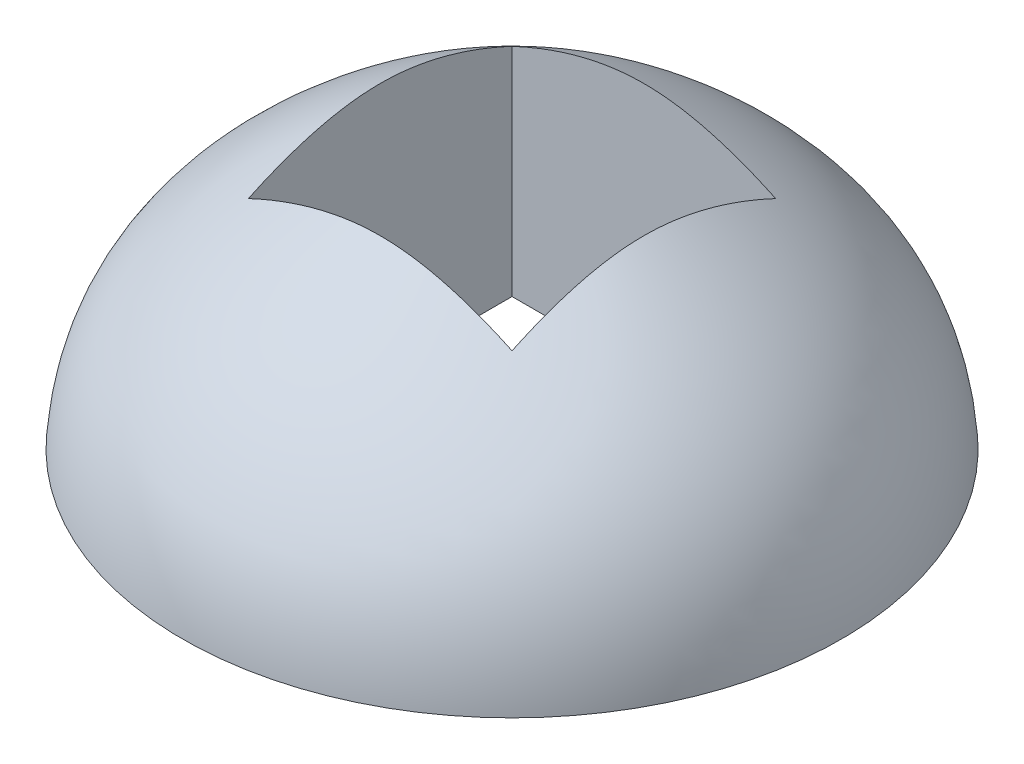
ISO-10303-21;
HEADER;
FILE_DESCRIPTION(('STEP AP214'),'2;1');
FILE_NAME('part.step','',(''),(''),'','','');
FILE_SCHEMA(('AUTOMOTIVE_DESIGN { 1 0 10303 214 1 1 1 1 }'));
ENDSEC;
DATA;
#1=APPLICATION_CONTEXT('core data for automotive mechanical design processes');
#2=APPLICATION_PROTOCOL_DEFINITION('international standard','automotive_design',2000,#1);
#3=PRODUCT_CONTEXT('',#1,'mechanical');
#4=PRODUCT('Part','Part','',(#3));
#5=PRODUCT_RELATED_PRODUCT_CATEGORY('part','',(#4));
#6=PRODUCT_DEFINITION_FORMATION('','',#4);
#7=PRODUCT_DEFINITION_CONTEXT('part definition',#1,'design');
#8=PRODUCT_DEFINITION('design','',#6,#7);
#9=PRODUCT_DEFINITION_SHAPE('','',#8);
#10=(LENGTH_UNIT() NAMED_UNIT(*) SI_UNIT(.MILLI.,.METRE.));
#11=(NAMED_UNIT(*) PLANE_ANGLE_UNIT() SI_UNIT($,.RADIAN.));
#12=(NAMED_UNIT(*) SI_UNIT($,.STERADIAN.) SOLID_ANGLE_UNIT());
#13=UNCERTAINTY_MEASURE_WITH_UNIT(LENGTH_MEASURE(1.E-05),#10,'distance_accuracy_value','');
#14=(GEOMETRIC_REPRESENTATION_CONTEXT(3) GLOBAL_UNCERTAINTY_ASSIGNED_CONTEXT((#13)) GLOBAL_UNIT_ASSIGNED_CONTEXT((#10,
#11,#12)) REPRESENTATION_CONTEXT('',''));
#15=CARTESIAN_POINT('',(0.,0.,0.));
#16=DIRECTION('',(0.,0.,1.));
#17=DIRECTION('',(1.,0.,0.));
#18=AXIS2_PLACEMENT_3D('',#15,#16,#17);
#19=CARTESIAN_POINT('',(0.,0.,0.));
#20=DIRECTION('',(0.,-1.,0.));
#21=DIRECTION('',(0.,0.,-1.));
#22=AXIS2_PLACEMENT_3D('',#19,#20,#21);
#23=PLANE('',#22);
#24=DIRECTION('',(0.,0.,1.));
#25=VECTOR('',#24,1.);
#26=CARTESIAN_POINT('',(0.2,0.,-0.2));
#27=LINE('',#26,#25);
#28=CARTESIAN_POINT('',(0.2,0.,-0.2));
#29=VERTEX_POINT('',#28);
#30=CARTESIAN_POINT('',(0.2,0.,0.2));
#31=VERTEX_POINT('',#30);
#32=EDGE_CURVE('E52',#29,#31,#27,.T.);
#33=ORIENTED_EDGE('',*,*,#32,.F.);
#34=DIRECTION('',(1.,0.,0.));
#35=VECTOR('',#34,1.);
#36=CARTESIAN_POINT('',(-0.2,0.,-0.2));
#37=LINE('',#36,#35);
#38=CARTESIAN_POINT('',(-0.2,0.,-0.2));
#39=VERTEX_POINT('',#38);
#40=EDGE_CURVE('E95',#39,#29,#37,.T.);
#41=ORIENTED_EDGE('',*,*,#40,.F.);
#42=DIRECTION('',(0.,0.,-1.));
#43=VECTOR('',#42,1.);
#44=CARTESIAN_POINT('',(-0.2,0.,-0.2));
#45=LINE('',#44,#43);
#46=CARTESIAN_POINT('',(-0.2,0.,0.2));
#47=VERTEX_POINT('',#46);
#48=EDGE_CURVE('E80',#47,#39,#45,.T.);
#49=ORIENTED_EDGE('',*,*,#48,.F.);
#50=DIRECTION('',(-1.,0.,0.));
#51=VECTOR('',#50,1.);
#52=CARTESIAN_POINT('',(-0.2,0.,0.2));
#53=LINE('',#52,#51);
#54=EDGE_CURVE('E89',#31,#47,#53,.T.);
#55=ORIENTED_EDGE('',*,*,#54,.F.);
#56=EDGE_LOOP('',(#33,#41,#49,#55));
#57=FACE_BOUND('',#56,.T.);
#58=CARTESIAN_POINT('',(0.,0.,0.));
#59=DIRECTION('',(0.,-1.,0.));
#60=DIRECTION('',(0.,0.,-1.));
#61=AXIS2_PLACEMENT_3D('',#58,#59,#60);
#62=CIRCLE('',#61,0.5);
#63=CARTESIAN_POINT('',(0.,0.,-0.5));
#64=VERTEX_POINT('',#63);
#65=EDGE_CURVE('E102',#64,#64,#62,.T.);
#66=ORIENTED_EDGE('',*,*,#65,.T.);
#67=EDGE_LOOP('',(#66));
#68=FACE_BOUND('',#67,.T.);
#69=ADVANCED_FACE('F33',(#57,#68),#23,.T.);
#70=CARTESIAN_POINT('',(0.5,0.,0.));
#71=CARTESIAN_POINT('',(0.480286730658789,0.285294789216923,0.));
#72=CARTESIAN_POINT('',(0.196047082133175,0.362615464846656,0.));
#73=CARTESIAN_POINT('',(0.,0.5,0.));
#74=B_SPLINE_CURVE_WITH_KNOTS('',3,(#70,#71,#72,#73),.UNSPECIFIED.,.F.,.F.,(4,4),(0.,1.),.UNSPECIFIED.);
#75=CARTESIAN_POINT('',(0.,0.,0.));
#76=DIRECTION('',(0.,-1.,0.));
#77=AXIS1_PLACEMENT('',#75,#76);
#78=SURFACE_OF_REVOLUTION('',#74,#77);
#79=CARTESIAN_POINT('',(0.200000000000068,0.328782187451355,0.200000000000024));
#80=CARTESIAN_POINT('',(0.200000000000025,0.335982640172982,0.184679463846204));
#81=CARTESIAN_POINT('',(0.200000000000007,0.342680838061193,0.169108599364926));
#82=CARTESIAN_POINT('',(0.199999999999993,0.35481834235478,0.13728336844331));
#83=CARTESIAN_POINT('',(0.199999999999998,0.360242327810111,0.12102321069613));
#84=CARTESIAN_POINT('',(0.200000000000003,0.370739603122892,0.0831417285857149));
#85=CARTESIAN_POINT('',(0.2,0.375243111782503,0.0613471360507934));
#86=CARTESIAN_POINT('',(0.2,0.378961904335457,0.0283785029903254));
#87=CARTESIAN_POINT('',(0.2,0.379697493847905,0.0173729332208342));
#88=CARTESIAN_POINT('',(0.2,0.380105293462711,-0.00465744244411206));
#89=CARTESIAN_POINT('',(0.2,0.379777627420552,-0.0156822459495619));
#90=CARTESIAN_POINT('',(0.199999999999999,0.37728545320003,-0.0479447823239719));
#91=CARTESIAN_POINT('',(0.2,0.373687790732988,-0.0690750385354958));
#92=CARTESIAN_POINT('',(0.2,0.363578298443816,-0.110686195527506));
#93=CARTESIAN_POINT('',(0.2,0.357051222828506,-0.131163090979574));
#94=CARTESIAN_POINT('',(0.2,0.346367639518441,-0.159529089093317));
#95=CARTESIAN_POINT('',(0.2,0.343067284437024,-0.167754447835112));
#96=CARTESIAN_POINT('',(0.2,0.336155680161305,-0.184009768267965));
#97=CARTESIAN_POINT('',(0.2,0.332546618507188,-0.192040659288157));
#98=CARTESIAN_POINT('',(0.2,0.328782187451422,-0.200000000000042));
#99=B_SPLINE_CURVE_WITH_KNOTS('',3,(#79,#80,#81,#82,#83,#84,#85,#86,#87,#88,#89,#90,#91,#92,#93,
#94,#95,#96,#97,#98),.UNSPECIFIED.,.F.,.F.,(4,2,2,2,2,2,2,2,2,4),(0.,0.05078825211544,
0.102159054248229,0.168601630031518,0.201644877353965,0.234684275704794,0.298673858729676,
0.363000400971716,0.389583700771525,0.415992160229419),.UNSPECIFIED.);
#100=CARTESIAN_POINT('',(0.2,0.328782187451355,0.2));
#101=VERTEX_POINT('',#100);
#102=CARTESIAN_POINT('',(0.2,0.328782187451437,-0.2));
#103=VERTEX_POINT('',#102);
#104=EDGE_CURVE('E11',#101,#103,#99,.T.);
#105=ORIENTED_EDGE('',*,*,#104,.F.);
#106=CARTESIAN_POINT('',(-0.199999999999964,0.328782187451437,0.200000000000048));
#107=CARTESIAN_POINT('',(-0.184679463846135,0.335982640173032,0.200000000000017));
#108=CARTESIAN_POINT('',(-0.169108599364854,0.342680838061228,0.200000000000005));
#109=CARTESIAN_POINT('',(-0.137283368443238,0.354818342354799,0.199999999999995));
#110=CARTESIAN_POINT('',(-0.121023210696062,0.360242327810131,0.199999999999999));
#111=CARTESIAN_POINT('',(-0.0831417285856537,0.370739603122907,0.200000000000002));
#112=CARTESIAN_POINT('',(-0.0613471360507351,0.375243111782514,0.2));
#113=CARTESIAN_POINT('',(-0.0283785029902728,0.378961904335461,0.2));
#114=CARTESIAN_POINT('',(-0.0173729332207838,0.379697493847907,0.2));
#115=CARTESIAN_POINT('',(0.00465744244415785,0.38010529346271,0.2));
#116=CARTESIAN_POINT('',(0.0156822459496053,0.37977762742055,0.2));
#117=CARTESIAN_POINT('',(0.0479447823240094,0.377285453200024,0.2));
#118=CARTESIAN_POINT('',(0.0690750385355296,0.373687790732981,0.2));
#119=CARTESIAN_POINT('',(0.110686195527532,0.363578298443808,0.2));
#120=CARTESIAN_POINT('',(0.131163090979598,0.357051222828498,0.2));
#121=CARTESIAN_POINT('',(0.159529089093341,0.346367639518431,0.2));
#122=CARTESIAN_POINT('',(0.167754447835141,0.343067284437012,0.2));
#123=CARTESIAN_POINT('',(0.184009768268001,0.336155680161289,0.2));
#124=CARTESIAN_POINT('',(0.192040659288197,0.33254661850717,0.2));
#125=CARTESIAN_POINT('',(0.200000000000085,0.328782187451401,0.2));
#126=B_SPLINE_CURVE_WITH_KNOTS('',3,(#106,#107,#108,#109,#110,#111,#112,#113,#114,#115,#116,
#117,#118,#119,#120,#121,#122,#123,#124,#125),.UNSPECIFIED.,.F.,.F.,(4,2,2,2,2,2,2,2,2,4),(0.,
0.0507882521154294,0.102159054248209,0.168601630031486,0.201644877353926,0.234684275704748,
0.29867385872962,0.363000400971651,0.389583700771473,0.415992160229379),.UNSPECIFIED.);
#127=CARTESIAN_POINT('',(-0.199999999999964,0.328782187451437,0.200000000000048));
#128=VERTEX_POINT('',#127);
#129=EDGE_CURVE('E122',#128,#101,#126,.T.);
#130=ORIENTED_EDGE('',*,*,#129,.F.);
#131=CARTESIAN_POINT('',(-0.200000000000068,0.328782187451355,-0.200000000000024));
#132=CARTESIAN_POINT('',(-0.200000000000025,0.335982640172982,-0.184679463846204));
#133=CARTESIAN_POINT('',(-0.200000000000007,0.342680838061193,-0.169108599364926));
#134=CARTESIAN_POINT('',(-0.199999999999993,0.35481834235478,-0.13728336844331));
#135=CARTESIAN_POINT('',(-0.199999999999998,0.360242327810111,-0.12102321069613));
#136=CARTESIAN_POINT('',(-0.200000000000003,0.370739603122892,-0.0831417285857148));
#137=CARTESIAN_POINT('',(-0.2,0.375243111782504,-0.0613471360507932));
#138=CARTESIAN_POINT('',(-0.2,0.378961904335457,-0.0283785029903253));
#139=CARTESIAN_POINT('',(-0.2,0.379697493847905,-0.0173729332208341));
#140=CARTESIAN_POINT('',(-0.2,0.380105293462711,0.00465744244411215));
#141=CARTESIAN_POINT('',(-0.2,0.379777627420552,0.015682245949562));
#142=CARTESIAN_POINT('',(-0.2,0.37728545320003,0.047944782323972));
#143=CARTESIAN_POINT('',(-0.2,0.373687790732988,0.0690750385354959));
#144=CARTESIAN_POINT('',(-0.2,0.363578298443816,0.110686195527506));
#145=CARTESIAN_POINT('',(-0.2,0.357051222828506,0.131163090979574));
#146=CARTESIAN_POINT('',(-0.2,0.34636763951844,0.159529089093317));
#147=CARTESIAN_POINT('',(-0.2,0.343067284437024,0.167754447835112));
#148=CARTESIAN_POINT('',(-0.2,0.336155680161305,0.184009768267965));
#149=CARTESIAN_POINT('',(-0.2,0.332546618507188,0.192040659288157));
#150=CARTESIAN_POINT('',(-0.2,0.328782187451422,0.200000000000042));
#151=B_SPLINE_CURVE_WITH_KNOTS('',3,(#131,#132,#133,#134,#135,#136,#137,#138,#139,#140,#141,
#142,#143,#144,#145,#146,#147,#148,#149,#150),.UNSPECIFIED.,.F.,.F.,(4,2,2,2,2,2,2,2,2,4),(0.,
0.0507882521154401,0.102159054248229,0.168601630031518,0.201644877353965,0.234684275704794,
0.298673858729676,0.363000400971716,0.389583700771525,0.415992160229418),.UNSPECIFIED.);
#152=CARTESIAN_POINT('',(-0.2,0.328782187451355,-0.2));
#153=VERTEX_POINT('',#152);
#154=EDGE_CURVE('E83',#153,#128,#151,.T.);
#155=ORIENTED_EDGE('',*,*,#154,.F.);
#156=CARTESIAN_POINT('',(0.199999999999964,0.328782187451437,-0.200000000000048));
#157=CARTESIAN_POINT('',(0.184679463846135,0.335982640173032,-0.200000000000017));
#158=CARTESIAN_POINT('',(0.169108599364854,0.342680838061228,-0.200000000000005));
#159=CARTESIAN_POINT('',(0.137283368443238,0.354818342354799,-0.199999999999995));
#160=CARTESIAN_POINT('',(0.121023210696062,0.360242327810131,-0.199999999999999));
#161=CARTESIAN_POINT('',(0.0831417285856537,0.370739603122907,-0.200000000000002));
#162=CARTESIAN_POINT('',(0.061347136050735,0.375243111782514,-0.2));
#163=CARTESIAN_POINT('',(0.0283785029902728,0.378961904335461,-0.2));
#164=CARTESIAN_POINT('',(0.0173729332207838,0.379697493847907,-0.2));
#165=CARTESIAN_POINT('',(-0.00465744244415777,0.38010529346271,-0.2));
#166=CARTESIAN_POINT('',(-0.0156822459496052,0.37977762742055,-0.2));
#167=CARTESIAN_POINT('',(-0.0479447823240092,0.377285453200024,-0.2));
#168=CARTESIAN_POINT('',(-0.0690750385355294,0.373687790732982,-0.2));
#169=CARTESIAN_POINT('',(-0.110686195527532,0.363578298443808,-0.2));
#170=CARTESIAN_POINT('',(-0.131163090979598,0.357051222828498,-0.2));
#171=CARTESIAN_POINT('',(-0.159529089093341,0.346367639518431,-0.2));
#172=CARTESIAN_POINT('',(-0.16775444783514,0.343067284437012,-0.2));
#173=CARTESIAN_POINT('',(-0.184009768268001,0.33615568016129,-0.2));
#174=CARTESIAN_POINT('',(-0.192040659288197,0.33254661850717,-0.2));
#175=CARTESIAN_POINT('',(-0.200000000000085,0.328782187451401,-0.2));
#176=B_SPLINE_CURVE_WITH_KNOTS('',3,(#156,#157,#158,#159,#160,#161,#162,#163,#164,#165,#166,
#167,#168,#169,#170,#171,#172,#173,#174,#175),.UNSPECIFIED.,.F.,.F.,(4,2,2,2,2,2,2,2,2,4),(0.,
0.0507882521154294,0.102159054248209,0.168601630031486,0.201644877353926,0.234684275704748,
0.29867385872962,0.36300040097165,0.389583700771473,0.415992160229379),.UNSPECIFIED.);
#177=EDGE_CURVE('E45',#103,#153,#176,.T.);
#178=ORIENTED_EDGE('',*,*,#177,.F.);
#179=EDGE_LOOP('',(#105,#130,#155,#178));
#180=FACE_BOUND('',#179,.T.);
#181=ORIENTED_EDGE('',*,*,#65,.F.);
#182=EDGE_LOOP('',(#181));
#183=FACE_BOUND('',#182,.T.);
#184=ADVANCED_FACE('F113',(#180,#183),#78,.F.);
#185=CARTESIAN_POINT('',(0.2,0.5,-0.2));
#186=DIRECTION('',(1.,0.,0.));
#187=DIRECTION('',(0.,0.,-1.));
#188=AXIS2_PLACEMENT_3D('',#185,#186,#187);
#189=PLANE('',#188);
#190=ORIENTED_EDGE('',*,*,#104,.T.);
#191=DIRECTION('',(0.,-1.,0.));
#192=VECTOR('',#191,1.);
#193=CARTESIAN_POINT('',(0.2,0.5,-0.2));
#194=LINE('',#193,#192);
#195=EDGE_CURVE('E100',#103,#29,#194,.T.);
#196=ORIENTED_EDGE('',*,*,#195,.T.);
#197=ORIENTED_EDGE('',*,*,#32,.T.);
#198=DIRECTION('',(0.,-1.,0.));
#199=VECTOR('',#198,1.);
#200=CARTESIAN_POINT('',(0.2,0.5,0.2));
#201=LINE('',#200,#199);
#202=EDGE_CURVE('E86',#101,#31,#201,.T.);
#203=ORIENTED_EDGE('',*,*,#202,.F.);
#204=EDGE_LOOP('',(#190,#196,#197,#203));
#205=FACE_BOUND('',#204,.T.);
#206=ADVANCED_FACE('F116',(#205),#189,.F.);
#207=CARTESIAN_POINT('',(-0.2,0.5,-0.2));
#208=DIRECTION('',(0.,0.,-1.));
#209=DIRECTION('',(-1.,0.,0.));
#210=AXIS2_PLACEMENT_3D('',#207,#208,#209);
#211=PLANE('',#210);
#212=ORIENTED_EDGE('',*,*,#177,.T.);
#213=DIRECTION('',(0.,-1.,0.));
#214=VECTOR('',#213,1.);
#215=CARTESIAN_POINT('',(-0.2,0.5,-0.2));
#216=LINE('',#215,#214);
#217=EDGE_CURVE('E85',#153,#39,#216,.T.);
#218=ORIENTED_EDGE('',*,*,#217,.T.);
#219=ORIENTED_EDGE('',*,*,#40,.T.);
#220=ORIENTED_EDGE('',*,*,#195,.F.);
#221=EDGE_LOOP('',(#212,#218,#219,#220));
#222=FACE_BOUND('',#221,.T.);
#223=ADVANCED_FACE('F139',(#222),#211,.F.);
#224=CARTESIAN_POINT('',(-0.2,0.5,-0.2));
#225=DIRECTION('',(-1.,0.,0.));
#226=DIRECTION('',(0.,0.,1.));
#227=AXIS2_PLACEMENT_3D('',#224,#225,#226);
#228=PLANE('',#227);
#229=ORIENTED_EDGE('',*,*,#154,.T.);
#230=DIRECTION('',(0.,-1.,0.));
#231=VECTOR('',#230,1.);
#232=CARTESIAN_POINT('',(-0.2,0.5,0.2));
#233=LINE('',#232,#231);
#234=EDGE_CURVE('E60',#128,#47,#233,.T.);
#235=ORIENTED_EDGE('',*,*,#234,.T.);
#236=ORIENTED_EDGE('',*,*,#48,.T.);
#237=ORIENTED_EDGE('',*,*,#217,.F.);
#238=EDGE_LOOP('',(#229,#235,#236,#237));
#239=FACE_BOUND('',#238,.T.);
#240=ADVANCED_FACE('F77',(#239),#228,.F.);
#241=CARTESIAN_POINT('',(-0.2,0.5,0.2));
#242=DIRECTION('',(0.,0.,1.));
#243=DIRECTION('',(1.,0.,0.));
#244=AXIS2_PLACEMENT_3D('',#241,#242,#243);
#245=PLANE('',#244);
#246=ORIENTED_EDGE('',*,*,#129,.T.);
#247=ORIENTED_EDGE('',*,*,#202,.T.);
#248=ORIENTED_EDGE('',*,*,#54,.T.);
#249=ORIENTED_EDGE('',*,*,#234,.F.);
#250=EDGE_LOOP('',(#246,#247,#248,#249));
#251=FACE_BOUND('',#250,.T.);
#252=ADVANCED_FACE('F90',(#251),#245,.F.);
#253=CLOSED_SHELL('',(#69,#184,#206,#223,#240,#252));
#254=MANIFOLD_SOLID_BREP('B2',#253);
#255=ADVANCED_BREP_SHAPE_REPRESENTATION('',(#18,#254),#14);
#256=SHAPE_DEFINITION_REPRESENTATION(#9,#255);
ENDSEC;
END-ISO-10303-21;
